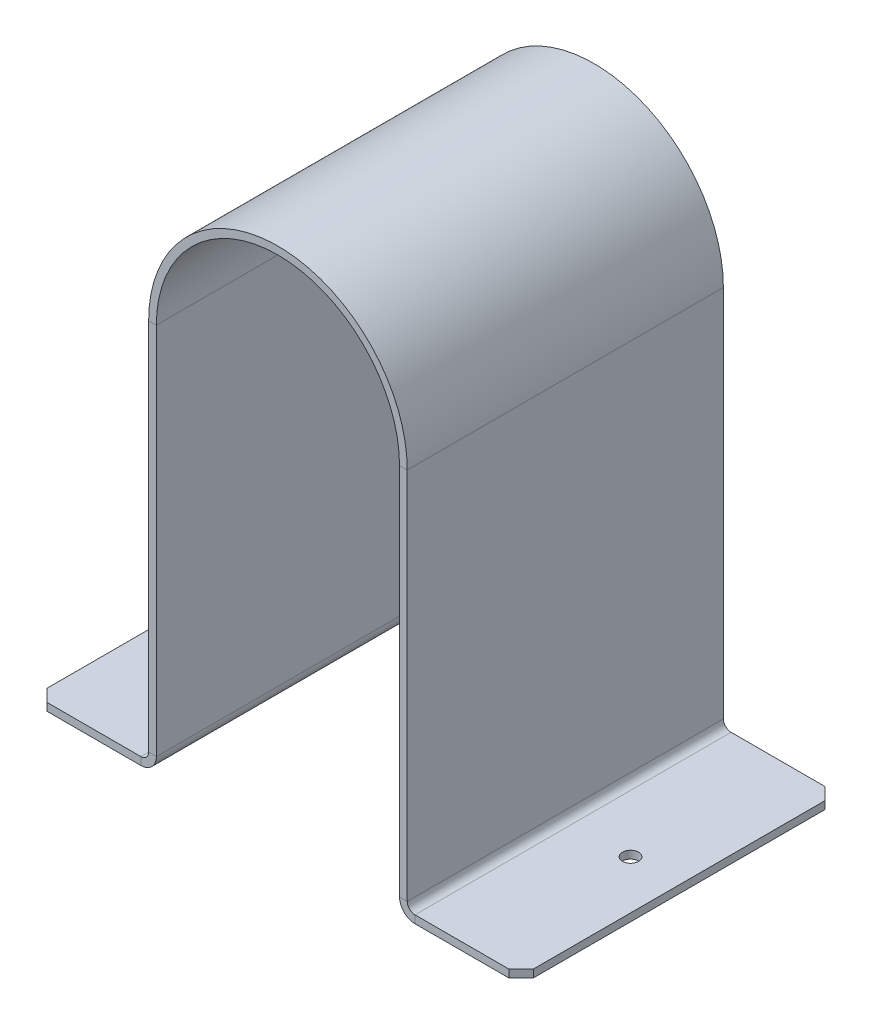
ISO-10303-21;
HEADER;
FILE_DESCRIPTION(('STEP AP214'),'2;1');
FILE_NAME('part.step','',(''),(''),'','','');
FILE_SCHEMA(('AUTOMOTIVE_DESIGN { 1 0 10303 214 1 1 1 1 }'));
ENDSEC;
DATA;
#1=APPLICATION_CONTEXT('core data for automotive mechanical design processes');
#2=APPLICATION_PROTOCOL_DEFINITION('international standard','automotive_design',2000,#1);
#3=PRODUCT_CONTEXT('',#1,'mechanical');
#4=PRODUCT('Part','Part','',(#3));
#5=PRODUCT_RELATED_PRODUCT_CATEGORY('part','',(#4));
#6=PRODUCT_DEFINITION_FORMATION('','',#4);
#7=PRODUCT_DEFINITION_CONTEXT('part definition',#1,'design');
#8=PRODUCT_DEFINITION('design','',#6,#7);
#9=PRODUCT_DEFINITION_SHAPE('','',#8);
#10=(LENGTH_UNIT() NAMED_UNIT(*) SI_UNIT(.MILLI.,.METRE.));
#11=(NAMED_UNIT(*) PLANE_ANGLE_UNIT() SI_UNIT($,.RADIAN.));
#12=(NAMED_UNIT(*) SI_UNIT($,.STERADIAN.) SOLID_ANGLE_UNIT());
#13=UNCERTAINTY_MEASURE_WITH_UNIT(LENGTH_MEASURE(1.E-05),#10,'distance_accuracy_value','');
#14=(GEOMETRIC_REPRESENTATION_CONTEXT(3) GLOBAL_UNCERTAINTY_ASSIGNED_CONTEXT((#13)) GLOBAL_UNIT_ASSIGNED_CONTEXT((#10,
#11,#12)) REPRESENTATION_CONTEXT('',''));
#15=CARTESIAN_POINT('',(0.,0.,0.));
#16=DIRECTION('',(0.,0.,1.));
#17=DIRECTION('',(1.,0.,0.));
#18=AXIS2_PLACEMENT_3D('',#15,#16,#17);
#19=CARTESIAN_POINT('',(-50.,160.,65.));
#20=DIRECTION('',(0.,0.,1.));
#21=DIRECTION('',(1.,0.,0.));
#22=AXIS2_PLACEMENT_3D('',#19,#20,#21);
#23=PLANE('',#22);
#24=DIRECTION('',(-1.,0.,0.));
#25=VECTOR('',#24,1.);
#26=CARTESIAN_POINT('',(-50.,160.,65.));
#27=LINE('',#26,#25);
#28=CARTESIAN_POINT('',(-50.,160.,65.));
#29=VERTEX_POINT('',#28);
#30=CARTESIAN_POINT('',(-53.175,160.,65.));
#31=VERTEX_POINT('',#30);
#32=EDGE_CURVE('E407',#29,#31,#27,.T.);
#33=ORIENTED_EDGE('',*,*,#32,.F.);
#34=CARTESIAN_POINT('',(0.,160.,65.));
#35=DIRECTION('',(0.,0.,-1.));
#36=DIRECTION('',(-1.,0.,0.));
#37=AXIS2_PLACEMENT_3D('',#34,#35,#36);
#38=CIRCLE('',#37,50.);
#39=CARTESIAN_POINT('',(50.,160.,65.));
#40=VERTEX_POINT('',#39);
#41=EDGE_CURVE('E261',#29,#40,#38,.T.);
#42=ORIENTED_EDGE('',*,*,#41,.T.);
#43=DIRECTION('',(-1.,0.,0.));
#44=VECTOR('',#43,1.);
#45=CARTESIAN_POINT('',(53.175,160.,65.));
#46=LINE('',#45,#44);
#47=CARTESIAN_POINT('',(53.175,160.,65.));
#48=VERTEX_POINT('',#47);
#49=EDGE_CURVE('E404',#48,#40,#46,.T.);
#50=ORIENTED_EDGE('',*,*,#49,.F.);
#51=CARTESIAN_POINT('',(0.,160.,65.));
#52=DIRECTION('',(0.,0.,1.));
#53=DIRECTION('',(1.,0.,0.));
#54=AXIS2_PLACEMENT_3D('',#51,#52,#53);
#55=CIRCLE('',#54,53.175);
#56=EDGE_CURVE('E232',#31,#48,#55,.F.);
#57=ORIENTED_EDGE('',*,*,#56,.F.);
#58=EDGE_LOOP('',(#33,#42,#50,#57));
#59=FACE_BOUND('',#58,.T.);
#60=ADVANCED_FACE('F46',(#59),#23,.T.);
#61=CARTESIAN_POINT('',(53.175,160.,65.));
#62=DIRECTION('',(0.,0.,1.));
#63=DIRECTION('',(1.,0.,0.));
#64=AXIS2_PLACEMENT_3D('',#61,#62,#63);
#65=PLANE('',#64);
#66=DIRECTION('',(0.,1.,0.));
#67=VECTOR('',#66,1.);
#68=CARTESIAN_POINT('',(-50.,0.,65.));
#69=LINE('',#68,#67);
#70=CARTESIAN_POINT('',(-50.,6.35,65.));
#71=VERTEX_POINT('',#70);
#72=EDGE_CURVE('E257',#71,#29,#69,.T.);
#73=ORIENTED_EDGE('',*,*,#72,.T.);
#74=ORIENTED_EDGE('',*,*,#32,.T.);
#75=DIRECTION('',(0.,1.,0.));
#76=VECTOR('',#75,1.);
#77=CARTESIAN_POINT('',(-53.175,0.,65.));
#78=LINE('',#77,#76);
#79=CARTESIAN_POINT('',(-53.175,6.35,65.));
#80=VERTEX_POINT('',#79);
#81=EDGE_CURVE('E239',#80,#31,#78,.T.);
#82=ORIENTED_EDGE('',*,*,#81,.F.);
#83=DIRECTION('',(1.,0.,0.));
#84=VECTOR('',#83,1.);
#85=CARTESIAN_POINT('',(-53.175,6.35,65.));
#86=LINE('',#85,#84);
#87=EDGE_CURVE('E391',#80,#71,#86,.T.);
#88=ORIENTED_EDGE('',*,*,#87,.T.);
#89=EDGE_LOOP('',(#73,#74,#82,#88));
#90=FACE_BOUND('',#89,.T.);
#91=ADVANCED_FACE('F490',(#90),#65,.T.);
#92=CARTESIAN_POINT('',(50.,160.,-65.));
#93=DIRECTION('',(0.,0.,-1.));
#94=DIRECTION('',(-1.,0.,0.));
#95=AXIS2_PLACEMENT_3D('',#92,#93,#94);
#96=PLANE('',#95);
#97=DIRECTION('',(1.,0.,0.));
#98=VECTOR('',#97,1.);
#99=CARTESIAN_POINT('',(50.,160.,-65.));
#100=LINE('',#99,#98);
#101=CARTESIAN_POINT('',(50.,160.,-65.));
#102=VERTEX_POINT('',#101);
#103=CARTESIAN_POINT('',(53.175,160.,-65.));
#104=VERTEX_POINT('',#103);
#105=EDGE_CURVE('E401',#102,#104,#100,.T.);
#106=ORIENTED_EDGE('',*,*,#105,.F.);
#107=CARTESIAN_POINT('',(0.,160.,-65.));
#108=DIRECTION('',(0.,0.,-1.));
#109=DIRECTION('',(-1.,0.,0.));
#110=AXIS2_PLACEMENT_3D('',#107,#108,#109);
#111=CIRCLE('',#110,50.);
#112=CARTESIAN_POINT('',(-50.,160.,-65.));
#113=VERTEX_POINT('',#112);
#114=EDGE_CURVE('E312',#113,#102,#111,.T.);
#115=ORIENTED_EDGE('',*,*,#114,.F.);
#116=DIRECTION('',(1.,0.,0.));
#117=VECTOR('',#116,1.);
#118=CARTESIAN_POINT('',(-53.175,160.,-65.));
#119=LINE('',#118,#117);
#120=CARTESIAN_POINT('',(-53.175,160.,-65.));
#121=VERTEX_POINT('',#120);
#122=EDGE_CURVE('E398',#121,#113,#119,.T.);
#123=ORIENTED_EDGE('',*,*,#122,.F.);
#124=CARTESIAN_POINT('',(0.,160.,-65.));
#125=DIRECTION('',(0.,0.,1.));
#126=DIRECTION('',(1.,0.,0.));
#127=AXIS2_PLACEMENT_3D('',#124,#125,#126);
#128=CIRCLE('',#127,53.175);
#129=EDGE_CURVE('E286',#121,#104,#128,.F.);
#130=ORIENTED_EDGE('',*,*,#129,.T.);
#131=EDGE_LOOP('',(#106,#115,#123,#130));
#132=FACE_BOUND('',#131,.T.);
#133=ADVANCED_FACE('F496',(#132),#96,.T.);
#134=CARTESIAN_POINT('',(-53.175,160.,-65.));
#135=DIRECTION('',(0.,0.,-1.));
#136=DIRECTION('',(-1.,0.,0.));
#137=AXIS2_PLACEMENT_3D('',#134,#135,#136);
#138=PLANE('',#137);
#139=DIRECTION('',(0.,-1.,0.));
#140=VECTOR('',#139,1.);
#141=CARTESIAN_POINT('',(50.,160.,-65.));
#142=LINE('',#141,#140);
#143=CARTESIAN_POINT('',(50.,6.34999999999999,-65.));
#144=VERTEX_POINT('',#143);
#145=EDGE_CURVE('E316',#102,#144,#142,.T.);
#146=ORIENTED_EDGE('',*,*,#145,.F.);
#147=ORIENTED_EDGE('',*,*,#105,.T.);
#148=DIRECTION('',(0.,-1.,0.));
#149=VECTOR('',#148,1.);
#150=CARTESIAN_POINT('',(53.175,160.,-65.));
#151=LINE('',#150,#149);
#152=CARTESIAN_POINT('',(53.175,6.35,-65.));
#153=VERTEX_POINT('',#152);
#154=EDGE_CURVE('E282',#104,#153,#151,.T.);
#155=ORIENTED_EDGE('',*,*,#154,.T.);
#156=DIRECTION('',(-1.,0.,0.));
#157=VECTOR('',#156,1.);
#158=CARTESIAN_POINT('',(53.175,6.35,-65.));
#159=LINE('',#158,#157);
#160=EDGE_CURVE('E377',#153,#144,#159,.T.);
#161=ORIENTED_EDGE('',*,*,#160,.T.);
#162=EDGE_LOOP('',(#146,#147,#155,#161));
#163=FACE_BOUND('',#162,.T.);
#164=ADVANCED_FACE('F616',(#163),#138,.T.);
#165=CARTESIAN_POINT('',(-56.35,0.,65.));
#166=DIRECTION('',(0.,0.,1.));
#167=DIRECTION('',(1.,0.,0.));
#168=AXIS2_PLACEMENT_3D('',#165,#166,#167);
#169=PLANE('',#168);
#170=DIRECTION('',(0.,1.,0.));
#171=VECTOR('',#170,1.);
#172=CARTESIAN_POINT('',(-56.35,0.,65.));
#173=LINE('',#172,#171);
#174=CARTESIAN_POINT('',(-56.35,0.,65.));
#175=VERTEX_POINT('',#174);
#176=CARTESIAN_POINT('',(-56.35,3.175,65.));
#177=VERTEX_POINT('',#176);
#178=EDGE_CURVE('E394',#175,#177,#173,.T.);
#179=ORIENTED_EDGE('',*,*,#178,.F.);
#180=CARTESIAN_POINT('',(-56.35,6.35,65.));
#181=DIRECTION('',(0.,0.,-1.));
#182=DIRECTION('',(-1.,0.,0.));
#183=AXIS2_PLACEMENT_3D('',#180,#181,#182);
#184=CIRCLE('',#183,6.35);
#185=EDGE_CURVE('E253',#175,#71,#184,.F.);
#186=ORIENTED_EDGE('',*,*,#185,.T.);
#187=ORIENTED_EDGE('',*,*,#87,.F.);
#188=CARTESIAN_POINT('',(-56.35,6.35,65.));
#189=DIRECTION('',(0.,0.,1.));
#190=DIRECTION('',(1.,0.,0.));
#191=AXIS2_PLACEMENT_3D('',#188,#189,#190);
#192=CIRCLE('',#191,3.175);
#193=EDGE_CURVE('E243',#177,#80,#192,.T.);
#194=ORIENTED_EDGE('',*,*,#193,.F.);
#195=EDGE_LOOP('',(#179,#186,#187,#194));
#196=FACE_BOUND('',#195,.T.);
#197=ADVANCED_FACE('F612',(#196),#169,.T.);
#198=CARTESIAN_POINT('',(-53.175,6.35,65.));
#199=DIRECTION('',(0.,0.,1.));
#200=DIRECTION('',(1.,0.,0.));
#201=AXIS2_PLACEMENT_3D('',#198,#199,#200);
#202=PLANE('',#201);
#203=DIRECTION('',(1.,0.,0.));
#204=VECTOR('',#203,1.);
#205=CARTESIAN_POINT('',(-100.,3.175,65.));
#206=LINE('',#205,#204);
#207=CARTESIAN_POINT('',(-95.,3.175,65.));
#208=VERTEX_POINT('',#207);
#209=EDGE_CURVE('E247',#208,#177,#206,.T.);
#210=ORIENTED_EDGE('',*,*,#209,.F.);
#211=DIRECTION('',(0.,-1.,0.));
#212=VECTOR('',#211,1.);
#213=CARTESIAN_POINT('',(-95.,6.35,65.));
#214=LINE('',#213,#212);
#215=CARTESIAN_POINT('',(-95.,0.,65.));
#216=VERTEX_POINT('',#215);
#217=EDGE_CURVE('E417',#208,#216,#214,.T.);
#218=ORIENTED_EDGE('',*,*,#217,.T.);
#219=DIRECTION('',(1.,0.,0.));
#220=VECTOR('',#219,1.);
#221=CARTESIAN_POINT('',(-100.,0.,65.));
#222=LINE('',#221,#220);
#223=EDGE_CURVE('E250',#216,#175,#222,.T.);
#224=ORIENTED_EDGE('',*,*,#223,.T.);
#225=ORIENTED_EDGE('',*,*,#178,.T.);
#226=EDGE_LOOP('',(#210,#218,#224,#225));
#227=FACE_BOUND('',#226,.T.);
#228=ADVANCED_FACE('F609',(#227),#202,.T.);
#229=CARTESIAN_POINT('',(-50.,6.35,-65.));
#230=DIRECTION('',(0.,0.,-1.));
#231=DIRECTION('',(-1.,0.,0.));
#232=AXIS2_PLACEMENT_3D('',#229,#230,#231);
#233=PLANE('',#232);
#234=DIRECTION('',(-1.,0.,0.));
#235=VECTOR('',#234,1.);
#236=CARTESIAN_POINT('',(-50.,6.35,-65.));
#237=LINE('',#236,#235);
#238=CARTESIAN_POINT('',(-50.,6.35,-65.));
#239=VERTEX_POINT('',#238);
#240=CARTESIAN_POINT('',(-53.175,6.35,-65.));
#241=VERTEX_POINT('',#240);
#242=EDGE_CURVE('E388',#239,#241,#237,.T.);
#243=ORIENTED_EDGE('',*,*,#242,.F.);
#244=CARTESIAN_POINT('',(-56.35,6.35,-65.));
#245=DIRECTION('',(0.,0.,-1.));
#246=DIRECTION('',(-1.,0.,0.));
#247=AXIS2_PLACEMENT_3D('',#244,#245,#246);
#248=CIRCLE('',#247,6.35);
#249=CARTESIAN_POINT('',(-56.35,0.,-65.));
#250=VERTEX_POINT('',#249);
#251=EDGE_CURVE('E304',#250,#239,#248,.F.);
#252=ORIENTED_EDGE('',*,*,#251,.F.);
#253=DIRECTION('',(0.,-1.,0.));
#254=VECTOR('',#253,1.);
#255=CARTESIAN_POINT('',(-56.35,3.175,-65.));
#256=LINE('',#255,#254);
#257=CARTESIAN_POINT('',(-56.35,3.175,-65.));
#258=VERTEX_POINT('',#257);
#259=EDGE_CURVE('E384',#258,#250,#256,.T.);
#260=ORIENTED_EDGE('',*,*,#259,.F.);
#261=CARTESIAN_POINT('',(-56.35,6.35,-65.));
#262=DIRECTION('',(0.,0.,1.));
#263=DIRECTION('',(1.,0.,0.));
#264=AXIS2_PLACEMENT_3D('',#261,#262,#263);
#265=CIRCLE('',#264,3.175);
#266=EDGE_CURVE('E294',#258,#241,#265,.T.);
#267=ORIENTED_EDGE('',*,*,#266,.T.);
#268=EDGE_LOOP('',(#243,#252,#260,#267));
#269=FACE_BOUND('',#268,.T.);
#270=ADVANCED_FACE('F471',(#269),#233,.T.);
#271=CARTESIAN_POINT('',(-56.35,3.175,-65.));
#272=DIRECTION('',(0.,0.,-1.));
#273=DIRECTION('',(-1.,0.,0.));
#274=AXIS2_PLACEMENT_3D('',#271,#272,#273);
#275=PLANE('',#274);
#276=DIRECTION('',(0.,1.,0.));
#277=VECTOR('',#276,1.);
#278=CARTESIAN_POINT('',(-50.,0.,-65.));
#279=LINE('',#278,#277);
#280=EDGE_CURVE('E308',#239,#113,#279,.T.);
#281=ORIENTED_EDGE('',*,*,#280,.F.);
#282=ORIENTED_EDGE('',*,*,#242,.T.);
#283=DIRECTION('',(0.,1.,0.));
#284=VECTOR('',#283,1.);
#285=CARTESIAN_POINT('',(-53.175,0.,-65.));
#286=LINE('',#285,#284);
#287=EDGE_CURVE('E290',#241,#121,#286,.T.);
#288=ORIENTED_EDGE('',*,*,#287,.T.);
#289=ORIENTED_EDGE('',*,*,#122,.T.);
#290=EDGE_LOOP('',(#281,#282,#288,#289));
#291=FACE_BOUND('',#290,.T.);
#292=ADVANCED_FACE('F603',(#291),#275,.T.);
#293=CARTESIAN_POINT('',(50.,6.34999999999999,65.));
#294=DIRECTION('',(0.,0.,1.));
#295=DIRECTION('',(1.,0.,0.));
#296=AXIS2_PLACEMENT_3D('',#293,#294,#295);
#297=PLANE('',#296);
#298=DIRECTION('',(1.,0.,0.));
#299=VECTOR('',#298,1.);
#300=CARTESIAN_POINT('',(50.,6.34999999999999,65.));
#301=LINE('',#300,#299);
#302=CARTESIAN_POINT('',(50.,6.34999999999999,65.));
#303=VERTEX_POINT('',#302);
#304=CARTESIAN_POINT('',(53.175,6.35,65.));
#305=VERTEX_POINT('',#304);
#306=EDGE_CURVE('E198',#303,#305,#301,.T.);
#307=ORIENTED_EDGE('',*,*,#306,.F.);
#308=CARTESIAN_POINT('',(56.35,6.35,65.));
#309=DIRECTION('',(0.,0.,-1.));
#310=DIRECTION('',(-1.,0.,0.));
#311=AXIS2_PLACEMENT_3D('',#308,#309,#310);
#312=CIRCLE('',#311,6.35);
#313=CARTESIAN_POINT('',(56.35,0.,65.));
#314=VERTEX_POINT('',#313);
#315=EDGE_CURVE('E192',#303,#314,#312,.F.);
#316=ORIENTED_EDGE('',*,*,#315,.T.);
#317=DIRECTION('',(0.,-1.,0.));
#318=VECTOR('',#317,1.);
#319=CARTESIAN_POINT('',(56.35,3.175,65.));
#320=LINE('',#319,#318);
#321=CARTESIAN_POINT('',(56.35,3.175,65.));
#322=VERTEX_POINT('',#321);
#323=EDGE_CURVE('E185',#322,#314,#320,.T.);
#324=ORIENTED_EDGE('',*,*,#323,.F.);
#325=CARTESIAN_POINT('',(56.35,6.35,65.));
#326=DIRECTION('',(0.,0.,1.));
#327=DIRECTION('',(1.,0.,0.));
#328=AXIS2_PLACEMENT_3D('',#325,#326,#327);
#329=CIRCLE('',#328,3.175);
#330=EDGE_CURVE('E189',#305,#322,#329,.T.);
#331=ORIENTED_EDGE('',*,*,#330,.F.);
#332=EDGE_LOOP('',(#307,#316,#324,#331));
#333=FACE_BOUND('',#332,.T.);
#334=ADVANCED_FACE('F187',(#333),#297,.T.);
#335=CARTESIAN_POINT('',(56.35,3.175,65.));
#336=DIRECTION('',(0.,0.,1.));
#337=DIRECTION('',(1.,0.,0.));
#338=AXIS2_PLACEMENT_3D('',#335,#336,#337);
#339=PLANE('',#338);
#340=DIRECTION('',(0.,-1.,0.));
#341=VECTOR('',#340,1.);
#342=CARTESIAN_POINT('',(50.,160.,65.));
#343=LINE('',#342,#341);
#344=EDGE_CURVE('E265',#40,#303,#343,.T.);
#345=ORIENTED_EDGE('',*,*,#344,.T.);
#346=ORIENTED_EDGE('',*,*,#306,.T.);
#347=DIRECTION('',(0.,-1.,0.));
#348=VECTOR('',#347,1.);
#349=CARTESIAN_POINT('',(53.175,160.,65.));
#350=LINE('',#349,#348);
#351=EDGE_CURVE('E229',#48,#305,#350,.T.);
#352=ORIENTED_EDGE('',*,*,#351,.F.);
#353=ORIENTED_EDGE('',*,*,#49,.T.);
#354=EDGE_LOOP('',(#345,#346,#352,#353));
#355=FACE_BOUND('',#354,.T.);
#356=ADVANCED_FACE('F597',(#355),#339,.T.);
#357=CARTESIAN_POINT('',(56.35,0.,-65.));
#358=DIRECTION('',(0.,0.,-1.));
#359=DIRECTION('',(-1.,0.,0.));
#360=AXIS2_PLACEMENT_3D('',#357,#358,#359);
#361=PLANE('',#360);
#362=DIRECTION('',(0.,1.,0.));
#363=VECTOR('',#362,1.);
#364=CARTESIAN_POINT('',(56.35,0.,-65.));
#365=LINE('',#364,#363);
#366=CARTESIAN_POINT('',(56.35,0.,-65.));
#367=VERTEX_POINT('',#366);
#368=CARTESIAN_POINT('',(56.35,3.175,-65.));
#369=VERTEX_POINT('',#368);
#370=EDGE_CURVE('E199',#367,#369,#365,.T.);
#371=ORIENTED_EDGE('',*,*,#370,.F.);
#372=CARTESIAN_POINT('',(56.35,6.35,-65.));
#373=DIRECTION('',(0.,0.,-1.));
#374=DIRECTION('',(-1.,0.,0.));
#375=AXIS2_PLACEMENT_3D('',#372,#373,#374);
#376=CIRCLE('',#375,6.35);
#377=EDGE_CURVE('E320',#144,#367,#376,.F.);
#378=ORIENTED_EDGE('',*,*,#377,.F.);
#379=ORIENTED_EDGE('',*,*,#160,.F.);
#380=CARTESIAN_POINT('',(56.35,6.35,-65.));
#381=DIRECTION('',(0.,0.,1.));
#382=DIRECTION('',(1.,0.,0.));
#383=AXIS2_PLACEMENT_3D('',#380,#381,#382);
#384=CIRCLE('',#383,3.175);
#385=EDGE_CURVE('E279',#153,#369,#384,.T.);
#386=ORIENTED_EDGE('',*,*,#385,.T.);
#387=EDGE_LOOP('',(#371,#378,#379,#386));
#388=FACE_BOUND('',#387,.T.);
#389=ADVANCED_FACE('F534',(#388),#361,.T.);
#390=CARTESIAN_POINT('',(53.175,6.35,-65.));
#391=DIRECTION('',(0.,0.,-1.));
#392=DIRECTION('',(-1.,0.,0.));
#393=AXIS2_PLACEMENT_3D('',#390,#391,#392);
#394=PLANE('',#393);
#395=DIRECTION('',(1.,0.,0.));
#396=VECTOR('',#395,1.);
#397=CARTESIAN_POINT('',(50.,3.175,-65.));
#398=LINE('',#397,#396);
#399=CARTESIAN_POINT('',(95.,3.175,-65.));
#400=VERTEX_POINT('',#399);
#401=EDGE_CURVE('E211',#369,#400,#398,.T.);
#402=ORIENTED_EDGE('',*,*,#401,.T.);
#403=DIRECTION('',(0.,-1.,0.));
#404=VECTOR('',#403,1.);
#405=CARTESIAN_POINT('',(95.,6.35,-65.));
#406=LINE('',#405,#404);
#407=CARTESIAN_POINT('',(95.,0.,-65.));
#408=VERTEX_POINT('',#407);
#409=EDGE_CURVE('E435',#400,#408,#406,.T.);
#410=ORIENTED_EDGE('',*,*,#409,.T.);
#411=DIRECTION('',(1.,0.,0.));
#412=VECTOR('',#411,1.);
#413=CARTESIAN_POINT('',(50.,0.,-65.));
#414=LINE('',#413,#412);
#415=EDGE_CURVE('E272',#367,#408,#414,.T.);
#416=ORIENTED_EDGE('',*,*,#415,.F.);
#417=ORIENTED_EDGE('',*,*,#370,.T.);
#418=EDGE_LOOP('',(#402,#410,#416,#417));
#419=FACE_BOUND('',#418,.T.);
#420=ADVANCED_FACE('F530',(#419),#394,.T.);
#421=CARTESIAN_POINT('',(50.,0.,65.));
#422=DIRECTION('',(0.,1.,0.));
#423=DIRECTION('',(0.,0.,1.));
#424=AXIS2_PLACEMENT_3D('',#421,#422,#423);
#425=PLANE('',#424);
#426=CARTESIAN_POINT('',(80.,0.,0.));
#427=DIRECTION('',(0.,1.,0.));
#428=DIRECTION('',(0.,0.,1.));
#429=AXIS2_PLACEMENT_3D('',#426,#427,#428);
#430=CIRCLE('',#429,3.3);
#431=CARTESIAN_POINT('',(80.,0.,3.3));
#432=VERTEX_POINT('',#431);
#433=EDGE_CURVE('E276',#432,#432,#430,.T.);
#434=ORIENTED_EDGE('',*,*,#433,.T.);
#435=EDGE_LOOP('',(#434));
#436=FACE_BOUND('',#435,.T.);
#437=ORIENTED_EDGE('',*,*,#415,.T.);
#438=DIRECTION('',(-0.707106781186548,0.,-0.707106781186548));
#439=VECTOR('',#438,1.);
#440=CARTESIAN_POINT('',(95.,0.,-65.));
#441=LINE('',#440,#439);
#442=CARTESIAN_POINT('',(100.,0.,-60.));
#443=VERTEX_POINT('',#442);
#444=EDGE_CURVE('E439',#408,#443,#441,.F.);
#445=ORIENTED_EDGE('',*,*,#444,.T.);
#446=DIRECTION('',(0.,0.,-1.));
#447=VECTOR('',#446,1.);
#448=CARTESIAN_POINT('',(100.,0.,65.));
#449=LINE('',#448,#447);
#450=CARTESIAN_POINT('',(100.,0.,60.));
#451=VERTEX_POINT('',#450);
#452=EDGE_CURVE('E373',#451,#443,#449,.T.);
#453=ORIENTED_EDGE('',*,*,#452,.F.);
#454=DIRECTION('',(0.707106781186548,0.,-0.707106781186548));
#455=VECTOR('',#454,1.);
#456=CARTESIAN_POINT('',(100.,0.,60.));
#457=LINE('',#456,#455);
#458=CARTESIAN_POINT('',(95.,0.,65.));
#459=VERTEX_POINT('',#458);
#460=EDGE_CURVE('E427',#451,#459,#457,.F.);
#461=ORIENTED_EDGE('',*,*,#460,.T.);
#462=DIRECTION('',(1.,0.,0.));
#463=VECTOR('',#462,1.);
#464=CARTESIAN_POINT('',(50.,0.,65.));
#465=LINE('',#464,#463);
#466=EDGE_CURVE('E223',#314,#459,#465,.T.);
#467=ORIENTED_EDGE('',*,*,#466,.F.);
#468=DIRECTION('',(0.,0.,-1.));
#469=VECTOR('',#468,1.);
#470=CARTESIAN_POINT('',(56.35,0.,65.));
#471=LINE('',#470,#469);
#472=EDGE_CURVE('E271',#314,#367,#471,.T.);
#473=ORIENTED_EDGE('',*,*,#472,.T.);
#474=EDGE_LOOP('',(#437,#445,#453,#461,#467,#473));
#475=FACE_BOUND('',#474,.T.);
#476=ADVANCED_FACE('F540',(#436,#475),#425,.F.);
#477=CARTESIAN_POINT('',(100.,3.175,65.));
#478=DIRECTION('',(1.,0.,0.));
#479=DIRECTION('',(0.,0.,-1.));
#480=AXIS2_PLACEMENT_3D('',#477,#478,#479);
#481=PLANE('',#480);
#482=ORIENTED_EDGE('',*,*,#452,.T.);
#483=DIRECTION('',(0.,1.,0.));
#484=VECTOR('',#483,1.);
#485=CARTESIAN_POINT('',(100.,3.175,-60.));
#486=LINE('',#485,#484);
#487=CARTESIAN_POINT('',(100.,3.175,-60.));
#488=VERTEX_POINT('',#487);
#489=EDGE_CURVE('E442',#443,#488,#486,.T.);
#490=ORIENTED_EDGE('',*,*,#489,.T.);
#491=DIRECTION('',(0.,0.,-1.));
#492=VECTOR('',#491,1.);
#493=CARTESIAN_POINT('',(100.,3.175,65.));
#494=LINE('',#493,#492);
#495=CARTESIAN_POINT('',(100.,3.175,60.));
#496=VERTEX_POINT('',#495);
#497=EDGE_CURVE('E216',#496,#488,#494,.T.);
#498=ORIENTED_EDGE('',*,*,#497,.F.);
#499=DIRECTION('',(0.,-1.,0.));
#500=VECTOR('',#499,1.);
#501=CARTESIAN_POINT('',(100.,3.175,60.));
#502=LINE('',#501,#500);
#503=EDGE_CURVE('E423',#496,#451,#502,.T.);
#504=ORIENTED_EDGE('',*,*,#503,.T.);
#505=EDGE_LOOP('',(#482,#490,#498,#504));
#506=FACE_BOUND('',#505,.T.);
#507=ADVANCED_FACE('F525',(#506),#481,.T.);
#508=CARTESIAN_POINT('',(50.,3.175,65.));
#509=DIRECTION('',(0.,1.,0.));
#510=DIRECTION('',(0.,0.,1.));
#511=AXIS2_PLACEMENT_3D('',#508,#509,#510);
#512=PLANE('',#511);
#513=CARTESIAN_POINT('',(80.,3.175,0.));
#514=DIRECTION('',(0.,1.,0.));
#515=DIRECTION('',(0.,0.,1.));
#516=AXIS2_PLACEMENT_3D('',#513,#514,#515);
#517=CIRCLE('',#516,3.3);
#518=CARTESIAN_POINT('',(80.,3.175,3.3));
#519=VERTEX_POINT('',#518);
#520=EDGE_CURVE('E546',#519,#519,#517,.T.);
#521=ORIENTED_EDGE('',*,*,#520,.F.);
#522=EDGE_LOOP('',(#521));
#523=FACE_BOUND('',#522,.T.);
#524=ORIENTED_EDGE('',*,*,#497,.T.);
#525=DIRECTION('',(0.707106781186548,0.,0.707106781186548));
#526=VECTOR('',#525,1.);
#527=CARTESIAN_POINT('',(137.5,3.175,-22.5));
#528=LINE('',#527,#526);
#529=EDGE_CURVE('E445',#488,#400,#528,.F.);
#530=ORIENTED_EDGE('',*,*,#529,.T.);
#531=ORIENTED_EDGE('',*,*,#401,.F.);
#532=DIRECTION('',(0.,0.,-1.));
#533=VECTOR('',#532,1.);
#534=CARTESIAN_POINT('',(56.35,3.175,65.));
#535=LINE('',#534,#533);
#536=EDGE_CURVE('E205',#322,#369,#535,.T.);
#537=ORIENTED_EDGE('',*,*,#536,.F.);
#538=DIRECTION('',(1.,0.,0.));
#539=VECTOR('',#538,1.);
#540=CARTESIAN_POINT('',(50.,3.175,65.));
#541=LINE('',#540,#539);
#542=CARTESIAN_POINT('',(95.,3.175,65.));
#543=VERTEX_POINT('',#542);
#544=EDGE_CURVE('E208',#322,#543,#541,.T.);
#545=ORIENTED_EDGE('',*,*,#544,.T.);
#546=DIRECTION('',(-0.707106781186548,0.,0.707106781186548));
#547=VECTOR('',#546,1.);
#548=CARTESIAN_POINT('',(72.5,3.175,87.5));
#549=LINE('',#548,#547);
#550=EDGE_CURVE('E432',#543,#496,#549,.F.);
#551=ORIENTED_EDGE('',*,*,#550,.T.);
#552=EDGE_LOOP('',(#524,#530,#531,#537,#545,#551));
#553=FACE_BOUND('',#552,.T.);
#554=ADVANCED_FACE('F207',(#523,#553),#512,.T.);
#555=CARTESIAN_POINT('',(56.35,6.35,65.));
#556=DIRECTION('',(0.,0.,-1.));
#557=DIRECTION('',(-1.,0.,0.));
#558=AXIS2_PLACEMENT_3D('',#555,#556,#557);
#559=CYLINDRICAL_SURFACE('',#558,3.175);
#560=ORIENTED_EDGE('',*,*,#385,.F.);
#561=DIRECTION('',(0.,0.,-1.));
#562=VECTOR('',#561,1.);
#563=CARTESIAN_POINT('',(53.175,6.35,65.));
#564=LINE('',#563,#562);
#565=EDGE_CURVE('E217',#305,#153,#564,.T.);
#566=ORIENTED_EDGE('',*,*,#565,.F.);
#567=ORIENTED_EDGE('',*,*,#330,.T.);
#568=ORIENTED_EDGE('',*,*,#536,.T.);
#569=EDGE_LOOP('',(#560,#566,#567,#568));
#570=FACE_BOUND('',#569,.T.);
#571=ADVANCED_FACE('F226',(#570),#559,.F.);
#572=CARTESIAN_POINT('',(53.175,160.,65.));
#573=DIRECTION('',(1.,0.,0.));
#574=DIRECTION('',(0.,1.,0.));
#575=AXIS2_PLACEMENT_3D('',#572,#573,#574);
#576=PLANE('',#575);
#577=ORIENTED_EDGE('',*,*,#154,.F.);
#578=DIRECTION('',(0.,0.,-1.));
#579=VECTOR('',#578,1.);
#580=CARTESIAN_POINT('',(53.175,160.,65.));
#581=LINE('',#580,#579);
#582=EDGE_CURVE('E365',#48,#104,#581,.T.);
#583=ORIENTED_EDGE('',*,*,#582,.F.);
#584=ORIENTED_EDGE('',*,*,#351,.T.);
#585=ORIENTED_EDGE('',*,*,#565,.T.);
#586=EDGE_LOOP('',(#577,#583,#584,#585));
#587=FACE_BOUND('',#586,.T.);
#588=ADVANCED_FACE('F578',(#587),#576,.T.);
#589=CARTESIAN_POINT('',(0.,160.,65.));
#590=DIRECTION('',(0.,0.,-1.));
#591=DIRECTION('',(-1.,0.,0.));
#592=AXIS2_PLACEMENT_3D('',#589,#590,#591);
#593=CYLINDRICAL_SURFACE('',#592,53.175);
#594=ORIENTED_EDGE('',*,*,#129,.F.);
#595=DIRECTION('',(0.,0.,-1.));
#596=VECTOR('',#595,1.);
#597=CARTESIAN_POINT('',(-53.175,160.,65.));
#598=LINE('',#597,#596);
#599=EDGE_CURVE('E361',#31,#121,#598,.T.);
#600=ORIENTED_EDGE('',*,*,#599,.F.);
#601=ORIENTED_EDGE('',*,*,#56,.T.);
#602=ORIENTED_EDGE('',*,*,#582,.T.);
#603=EDGE_LOOP('',(#594,#600,#601,#602));
#604=FACE_BOUND('',#603,.T.);
#605=ADVANCED_FACE('F574',(#604),#593,.T.);
#606=CARTESIAN_POINT('',(-53.175,0.,65.));
#607=DIRECTION('',(-1.,0.,0.));
#608=DIRECTION('',(0.,0.,1.));
#609=AXIS2_PLACEMENT_3D('',#606,#607,#608);
#610=PLANE('',#609);
#611=ORIENTED_EDGE('',*,*,#287,.F.);
#612=DIRECTION('',(0.,0.,-1.));
#613=VECTOR('',#612,1.);
#614=CARTESIAN_POINT('',(-53.175,6.35,65.));
#615=LINE('',#614,#613);
#616=EDGE_CURVE('E357',#80,#241,#615,.T.);
#617=ORIENTED_EDGE('',*,*,#616,.F.);
#618=ORIENTED_EDGE('',*,*,#81,.T.);
#619=ORIENTED_EDGE('',*,*,#599,.T.);
#620=EDGE_LOOP('',(#611,#617,#618,#619));
#621=FACE_BOUND('',#620,.T.);
#622=ADVANCED_FACE('F568',(#621),#610,.T.);
#623=CARTESIAN_POINT('',(-56.35,6.35,65.));
#624=DIRECTION('',(0.,0.,-1.));
#625=DIRECTION('',(-1.,0.,0.));
#626=AXIS2_PLACEMENT_3D('',#623,#624,#625);
#627=CYLINDRICAL_SURFACE('',#626,3.175);
#628=ORIENTED_EDGE('',*,*,#266,.F.);
#629=DIRECTION('',(0.,0.,-1.));
#630=VECTOR('',#629,1.);
#631=CARTESIAN_POINT('',(-56.35,3.175,65.));
#632=LINE('',#631,#630);
#633=EDGE_CURVE('E353',#177,#258,#632,.T.);
#634=ORIENTED_EDGE('',*,*,#633,.F.);
#635=ORIENTED_EDGE('',*,*,#193,.T.);
#636=ORIENTED_EDGE('',*,*,#616,.T.);
#637=EDGE_LOOP('',(#628,#634,#635,#636));
#638=FACE_BOUND('',#637,.T.);
#639=ADVANCED_FACE('F467',(#638),#627,.F.);
#640=CARTESIAN_POINT('',(-100.,3.175,65.));
#641=DIRECTION('',(0.,1.,0.));
#642=DIRECTION('',(0.,0.,1.));
#643=AXIS2_PLACEMENT_3D('',#640,#641,#642);
#644=PLANE('',#643);
#645=CARTESIAN_POINT('',(-80.,3.175,0.));
#646=DIRECTION('',(0.,1.,0.));
#647=DIRECTION('',(0.,0.,1.));
#648=AXIS2_PLACEMENT_3D('',#645,#646,#647);
#649=CIRCLE('',#648,3.3);
#650=CARTESIAN_POINT('',(-80.,3.175,3.3));
#651=VERTEX_POINT('',#650);
#652=EDGE_CURVE('E554',#651,#651,#649,.T.);
#653=ORIENTED_EDGE('',*,*,#652,.F.);
#654=EDGE_LOOP('',(#653));
#655=FACE_BOUND('',#654,.T.);
#656=DIRECTION('',(1.,0.,0.));
#657=VECTOR('',#656,1.);
#658=CARTESIAN_POINT('',(-100.,3.175,-65.));
#659=LINE('',#658,#657);
#660=CARTESIAN_POINT('',(-95.,3.175,-65.));
#661=VERTEX_POINT('',#660);
#662=EDGE_CURVE('E298',#661,#258,#659,.T.);
#663=ORIENTED_EDGE('',*,*,#662,.F.);
#664=DIRECTION('',(-0.707106781186548,0.,0.707106781186548));
#665=VECTOR('',#664,1.);
#666=CARTESIAN_POINT('',(-162.5,3.175,2.50000000000002));
#667=LINE('',#666,#665);
#668=CARTESIAN_POINT('',(-100.,3.175,-60.));
#669=VERTEX_POINT('',#668);
#670=EDGE_CURVE('E70',#661,#669,#667,.T.);
#671=ORIENTED_EDGE('',*,*,#670,.T.);
#672=DIRECTION('',(0.,0.,-1.));
#673=VECTOR('',#672,1.);
#674=CARTESIAN_POINT('',(-100.,3.175,65.));
#675=LINE('',#674,#673);
#676=CARTESIAN_POINT('',(-100.,3.175,60.));
#677=VERTEX_POINT('',#676);
#678=EDGE_CURVE('E350',#677,#669,#675,.T.);
#679=ORIENTED_EDGE('',*,*,#678,.F.);
#680=DIRECTION('',(-0.707106781186548,0.,-0.707106781186548));
#681=VECTOR('',#680,1.);
#682=CARTESIAN_POINT('',(-97.5,3.175,62.5));
#683=LINE('',#682,#681);
#684=EDGE_CURVE('E414',#677,#208,#683,.F.);
#685=ORIENTED_EDGE('',*,*,#684,.T.);
#686=ORIENTED_EDGE('',*,*,#209,.T.);
#687=ORIENTED_EDGE('',*,*,#633,.T.);
#688=EDGE_LOOP('',(#663,#671,#679,#685,#686,#687));
#689=FACE_BOUND('',#688,.T.);
#690=ADVANCED_FACE('F461',(#655,#689),#644,.T.);
#691=CARTESIAN_POINT('',(-100.,0.,65.));
#692=DIRECTION('',(-1.,0.,0.));
#693=DIRECTION('',(0.,0.,1.));
#694=AXIS2_PLACEMENT_3D('',#691,#692,#693);
#695=PLANE('',#694);
#696=ORIENTED_EDGE('',*,*,#678,.T.);
#697=DIRECTION('',(0.,-1.,0.));
#698=VECTOR('',#697,1.);
#699=CARTESIAN_POINT('',(-100.,0.,-60.));
#700=LINE('',#699,#698);
#701=CARTESIAN_POINT('',(-100.,0.,-60.));
#702=VERTEX_POINT('',#701);
#703=EDGE_CURVE('E56',#669,#702,#700,.T.);
#704=ORIENTED_EDGE('',*,*,#703,.T.);
#705=DIRECTION('',(0.,0.,-1.));
#706=VECTOR('',#705,1.);
#707=CARTESIAN_POINT('',(-100.,0.,65.));
#708=LINE('',#707,#706);
#709=CARTESIAN_POINT('',(-100.,0.,60.));
#710=VERTEX_POINT('',#709);
#711=EDGE_CURVE('E347',#710,#702,#708,.T.);
#712=ORIENTED_EDGE('',*,*,#711,.F.);
#713=DIRECTION('',(0.,1.,0.));
#714=VECTOR('',#713,1.);
#715=CARTESIAN_POINT('',(-100.,0.,60.));
#716=LINE('',#715,#714);
#717=EDGE_CURVE('E410',#710,#677,#716,.T.);
#718=ORIENTED_EDGE('',*,*,#717,.T.);
#719=EDGE_LOOP('',(#696,#704,#712,#718));
#720=FACE_BOUND('',#719,.T.);
#721=ADVANCED_FACE('F561',(#720),#695,.T.);
#722=CARTESIAN_POINT('',(-100.,0.,65.));
#723=DIRECTION('',(0.,1.,0.));
#724=DIRECTION('',(0.,0.,1.));
#725=AXIS2_PLACEMENT_3D('',#722,#723,#724);
#726=PLANE('',#725);
#727=CARTESIAN_POINT('',(-80.,0.,0.));
#728=DIRECTION('',(0.,1.,0.));
#729=DIRECTION('',(0.,0.,1.));
#730=AXIS2_PLACEMENT_3D('',#727,#728,#729);
#731=CIRCLE('',#730,3.3);
#732=CARTESIAN_POINT('',(-80.,0.,3.3));
#733=VERTEX_POINT('',#732);
#734=EDGE_CURVE('E550',#733,#733,#731,.T.);
#735=ORIENTED_EDGE('',*,*,#734,.T.);
#736=EDGE_LOOP('',(#735));
#737=FACE_BOUND('',#736,.T.);
#738=ORIENTED_EDGE('',*,*,#711,.T.);
#739=DIRECTION('',(0.707106781186548,0.,-0.707106781186548));
#740=VECTOR('',#739,1.);
#741=CARTESIAN_POINT('',(-95.,0.,-65.));
#742=LINE('',#741,#740);
#743=CARTESIAN_POINT('',(-95.,0.,-65.));
#744=VERTEX_POINT('',#743);
#745=EDGE_CURVE('E11',#702,#744,#742,.T.);
#746=ORIENTED_EDGE('',*,*,#745,.T.);
#747=DIRECTION('',(1.,0.,0.));
#748=VECTOR('',#747,1.);
#749=CARTESIAN_POINT('',(-100.,0.,-65.));
#750=LINE('',#749,#748);
#751=EDGE_CURVE('E301',#744,#250,#750,.T.);
#752=ORIENTED_EDGE('',*,*,#751,.T.);
#753=DIRECTION('',(0.,0.,-1.));
#754=VECTOR('',#753,1.);
#755=CARTESIAN_POINT('',(-56.35,0.,65.));
#756=LINE('',#755,#754);
#757=EDGE_CURVE('E343',#175,#250,#756,.T.);
#758=ORIENTED_EDGE('',*,*,#757,.F.);
#759=ORIENTED_EDGE('',*,*,#223,.F.);
#760=DIRECTION('',(0.707106781186548,0.,0.707106781186548));
#761=VECTOR('',#760,1.);
#762=CARTESIAN_POINT('',(-100.,0.,60.));
#763=LINE('',#762,#761);
#764=EDGE_CURVE('E420',#216,#710,#763,.F.);
#765=ORIENTED_EDGE('',*,*,#764,.T.);
#766=EDGE_LOOP('',(#738,#746,#752,#758,#759,#765));
#767=FACE_BOUND('',#766,.T.);
#768=ADVANCED_FACE('F480',(#737,#767),#726,.F.);
#769=CARTESIAN_POINT('',(-56.35,6.35,65.));
#770=DIRECTION('',(0.,0.,-1.));
#771=DIRECTION('',(-1.,0.,0.));
#772=AXIS2_PLACEMENT_3D('',#769,#770,#771);
#773=CYLINDRICAL_SURFACE('',#772,6.35);
#774=ORIENTED_EDGE('',*,*,#251,.T.);
#775=DIRECTION('',(0.,0.,-1.));
#776=VECTOR('',#775,1.);
#777=CARTESIAN_POINT('',(-50.,6.35,65.));
#778=LINE('',#777,#776);
#779=EDGE_CURVE('E339',#71,#239,#778,.T.);
#780=ORIENTED_EDGE('',*,*,#779,.F.);
#781=ORIENTED_EDGE('',*,*,#185,.F.);
#782=ORIENTED_EDGE('',*,*,#757,.T.);
#783=EDGE_LOOP('',(#774,#780,#781,#782));
#784=FACE_BOUND('',#783,.T.);
#785=ADVANCED_FACE('F476',(#784),#773,.T.);
#786=CARTESIAN_POINT('',(-50.,0.,65.));
#787=DIRECTION('',(-1.,0.,0.));
#788=DIRECTION('',(0.,0.,1.));
#789=AXIS2_PLACEMENT_3D('',#786,#787,#788);
#790=PLANE('',#789);
#791=ORIENTED_EDGE('',*,*,#280,.T.);
#792=DIRECTION('',(0.,0.,-1.));
#793=VECTOR('',#792,1.);
#794=CARTESIAN_POINT('',(-50.,160.,65.));
#795=LINE('',#794,#793);
#796=EDGE_CURVE('E335',#29,#113,#795,.T.);
#797=ORIENTED_EDGE('',*,*,#796,.F.);
#798=ORIENTED_EDGE('',*,*,#72,.F.);
#799=ORIENTED_EDGE('',*,*,#779,.T.);
#800=EDGE_LOOP('',(#791,#797,#798,#799));
#801=FACE_BOUND('',#800,.T.);
#802=ADVANCED_FACE('F645',(#801),#790,.F.);
#803=CARTESIAN_POINT('',(0.,160.,65.));
#804=DIRECTION('',(0.,0.,-1.));
#805=DIRECTION('',(-1.,0.,0.));
#806=AXIS2_PLACEMENT_3D('',#803,#804,#805);
#807=CYLINDRICAL_SURFACE('',#806,50.);
#808=ORIENTED_EDGE('',*,*,#114,.T.);
#809=DIRECTION('',(0.,0.,-1.));
#810=VECTOR('',#809,1.);
#811=CARTESIAN_POINT('',(50.,160.,65.));
#812=LINE('',#811,#810);
#813=EDGE_CURVE('E331',#40,#102,#812,.T.);
#814=ORIENTED_EDGE('',*,*,#813,.F.);
#815=ORIENTED_EDGE('',*,*,#41,.F.);
#816=ORIENTED_EDGE('',*,*,#796,.T.);
#817=EDGE_LOOP('',(#808,#814,#815,#816));
#818=FACE_BOUND('',#817,.T.);
#819=ADVANCED_FACE('F629',(#818),#807,.F.);
#820=CARTESIAN_POINT('',(50.,160.,65.));
#821=DIRECTION('',(1.,0.,0.));
#822=DIRECTION('',(0.,1.,0.));
#823=AXIS2_PLACEMENT_3D('',#820,#821,#822);
#824=PLANE('',#823);
#825=ORIENTED_EDGE('',*,*,#145,.T.);
#826=DIRECTION('',(0.,0.,-1.));
#827=VECTOR('',#826,1.);
#828=CARTESIAN_POINT('',(50.,6.34999999999999,65.));
#829=LINE('',#828,#827);
#830=EDGE_CURVE('E327',#303,#144,#829,.T.);
#831=ORIENTED_EDGE('',*,*,#830,.F.);
#832=ORIENTED_EDGE('',*,*,#344,.F.);
#833=ORIENTED_EDGE('',*,*,#813,.T.);
#834=EDGE_LOOP('',(#825,#831,#832,#833));
#835=FACE_BOUND('',#834,.T.);
#836=ADVANCED_FACE('F634',(#835),#824,.F.);
#837=CARTESIAN_POINT('',(56.35,6.35,65.));
#838=DIRECTION('',(0.,0.,-1.));
#839=DIRECTION('',(-1.,0.,0.));
#840=AXIS2_PLACEMENT_3D('',#837,#838,#839);
#841=CYLINDRICAL_SURFACE('',#840,6.35);
#842=ORIENTED_EDGE('',*,*,#377,.T.);
#843=ORIENTED_EDGE('',*,*,#472,.F.);
#844=ORIENTED_EDGE('',*,*,#315,.F.);
#845=ORIENTED_EDGE('',*,*,#830,.T.);
#846=EDGE_LOOP('',(#842,#843,#844,#845));
#847=FACE_BOUND('',#846,.T.);
#848=ADVANCED_FACE('F536',(#847),#841,.T.);
#849=CARTESIAN_POINT('',(56.35,6.35,65.));
#850=DIRECTION('',(0.,0.,1.));
#851=DIRECTION('',(1.,0.,0.));
#852=AXIS2_PLACEMENT_3D('',#849,#850,#851);
#853=PLANE('',#852);
#854=ORIENTED_EDGE('',*,*,#466,.T.);
#855=DIRECTION('',(0.,1.,0.));
#856=VECTOR('',#855,1.);
#857=CARTESIAN_POINT('',(95.,6.35,65.));
#858=LINE('',#857,#856);
#859=EDGE_CURVE('E221',#459,#543,#858,.T.);
#860=ORIENTED_EDGE('',*,*,#859,.T.);
#861=ORIENTED_EDGE('',*,*,#544,.F.);
#862=ORIENTED_EDGE('',*,*,#323,.T.);
#863=EDGE_LOOP('',(#854,#860,#861,#862));
#864=FACE_BOUND('',#863,.T.);
#865=ADVANCED_FACE('F219',(#864),#853,.T.);
#866=CARTESIAN_POINT('',(56.35,6.35,-65.));
#867=DIRECTION('',(0.,0.,1.));
#868=DIRECTION('',(1.,0.,0.));
#869=AXIS2_PLACEMENT_3D('',#866,#867,#868);
#870=PLANE('',#869);
#871=ORIENTED_EDGE('',*,*,#751,.F.);
#872=DIRECTION('',(0.,1.,0.));
#873=VECTOR('',#872,1.);
#874=CARTESIAN_POINT('',(-95.,3.175,-65.));
#875=LINE('',#874,#873);
#876=EDGE_CURVE('E448',#744,#661,#875,.T.);
#877=ORIENTED_EDGE('',*,*,#876,.T.);
#878=ORIENTED_EDGE('',*,*,#662,.T.);
#879=ORIENTED_EDGE('',*,*,#259,.T.);
#880=EDGE_LOOP('',(#871,#877,#878,#879));
#881=FACE_BOUND('',#880,.T.);
#882=ADVANCED_FACE('F457',(#881),#870,.F.);
#883=CARTESIAN_POINT('',(80.,3.175,0.));
#884=DIRECTION('',(0.,1.,0.));
#885=DIRECTION('',(0.,0.,1.));
#886=AXIS2_PLACEMENT_3D('',#883,#884,#885);
#887=CYLINDRICAL_SURFACE('',#886,3.3);
#888=ORIENTED_EDGE('',*,*,#433,.F.);
#889=EDGE_LOOP('',(#888));
#890=FACE_BOUND('',#889,.T.);
#891=ORIENTED_EDGE('',*,*,#520,.T.);
#892=EDGE_LOOP('',(#891));
#893=FACE_BOUND('',#892,.T.);
#894=ADVANCED_FACE('F662',(#890,#893),#887,.F.);
#895=CARTESIAN_POINT('',(-80.,3.175,0.));
#896=DIRECTION('',(0.,1.,0.));
#897=DIRECTION('',(0.,0.,1.));
#898=AXIS2_PLACEMENT_3D('',#895,#896,#897);
#899=CYLINDRICAL_SURFACE('',#898,3.3);
#900=ORIENTED_EDGE('',*,*,#734,.F.);
#901=EDGE_LOOP('',(#900));
#902=FACE_BOUND('',#901,.T.);
#903=ORIENTED_EDGE('',*,*,#652,.T.);
#904=EDGE_LOOP('',(#903));
#905=FACE_BOUND('',#904,.T.);
#906=ADVANCED_FACE('F508',(#902,#905),#899,.F.);
#907=CARTESIAN_POINT('',(-100.,0.,60.));
#908=DIRECTION('',(0.707106781186547,0.,-0.707106781186547));
#909=DIRECTION('',(0.,1.,0.));
#910=AXIS2_PLACEMENT_3D('',#907,#908,#909);
#911=PLANE('',#910);
#912=ORIENTED_EDGE('',*,*,#764,.F.);
#913=ORIENTED_EDGE('',*,*,#217,.F.);
#914=ORIENTED_EDGE('',*,*,#684,.F.);
#915=ORIENTED_EDGE('',*,*,#717,.F.);
#916=EDGE_LOOP('',(#912,#913,#914,#915));
#917=FACE_BOUND('',#916,.T.);
#918=ADVANCED_FACE('F502',(#917),#911,.F.);
#919=CARTESIAN_POINT('',(100.,3.175,60.));
#920=DIRECTION('',(-0.707106781186547,0.,-0.707106781186547));
#921=DIRECTION('',(0.,-1.,0.));
#922=AXIS2_PLACEMENT_3D('',#919,#920,#921);
#923=PLANE('',#922);
#924=ORIENTED_EDGE('',*,*,#550,.F.);
#925=ORIENTED_EDGE('',*,*,#859,.F.);
#926=ORIENTED_EDGE('',*,*,#460,.F.);
#927=ORIENTED_EDGE('',*,*,#503,.F.);
#928=EDGE_LOOP('',(#924,#925,#926,#927));
#929=FACE_BOUND('',#928,.T.);
#930=ADVANCED_FACE('F487',(#929),#923,.F.);
#931=CARTESIAN_POINT('',(95.,6.35,-65.));
#932=DIRECTION('',(-0.707106781186547,0.,0.707106781186547));
#933=DIRECTION('',(0.,-1.,0.));
#934=AXIS2_PLACEMENT_3D('',#931,#932,#933);
#935=PLANE('',#934);
#936=ORIENTED_EDGE('',*,*,#529,.F.);
#937=ORIENTED_EDGE('',*,*,#489,.F.);
#938=ORIENTED_EDGE('',*,*,#444,.F.);
#939=ORIENTED_EDGE('',*,*,#409,.F.);
#940=EDGE_LOOP('',(#936,#937,#938,#939));
#941=FACE_BOUND('',#940,.T.);
#942=ADVANCED_FACE('F483',(#941),#935,.F.);
#943=CARTESIAN_POINT('',(-95.,6.35,-65.));
#944=DIRECTION('',(-0.707106781186547,0.,-0.707106781186547));
#945=DIRECTION('',(0.,-1.,0.));
#946=AXIS2_PLACEMENT_3D('',#943,#944,#945);
#947=PLANE('',#946);
#948=ORIENTED_EDGE('',*,*,#745,.F.);
#949=ORIENTED_EDGE('',*,*,#703,.F.);
#950=ORIENTED_EDGE('',*,*,#670,.F.);
#951=ORIENTED_EDGE('',*,*,#876,.F.);
#952=EDGE_LOOP('',(#948,#949,#950,#951));
#953=FACE_BOUND('',#952,.T.);
#954=ADVANCED_FACE('F49',(#953),#947,.T.);
#955=CLOSED_SHELL('',(#60,#91,#133,#164,#197,#228,#270,#292,#334,#356,#389,#420,#476,#507,#554,
#571,#588,#605,#622,#639,#690,#721,#768,#785,#802,#819,#836,#848,#865,#882,#894,#906,#918,#930,
#942,#954));
#956=MANIFOLD_SOLID_BREP('B2',#955);
#957=ADVANCED_BREP_SHAPE_REPRESENTATION('',(#18,#956),#14);
#958=SHAPE_DEFINITION_REPRESENTATION(#9,#957);
ENDSEC;
END-ISO-10303-21;
